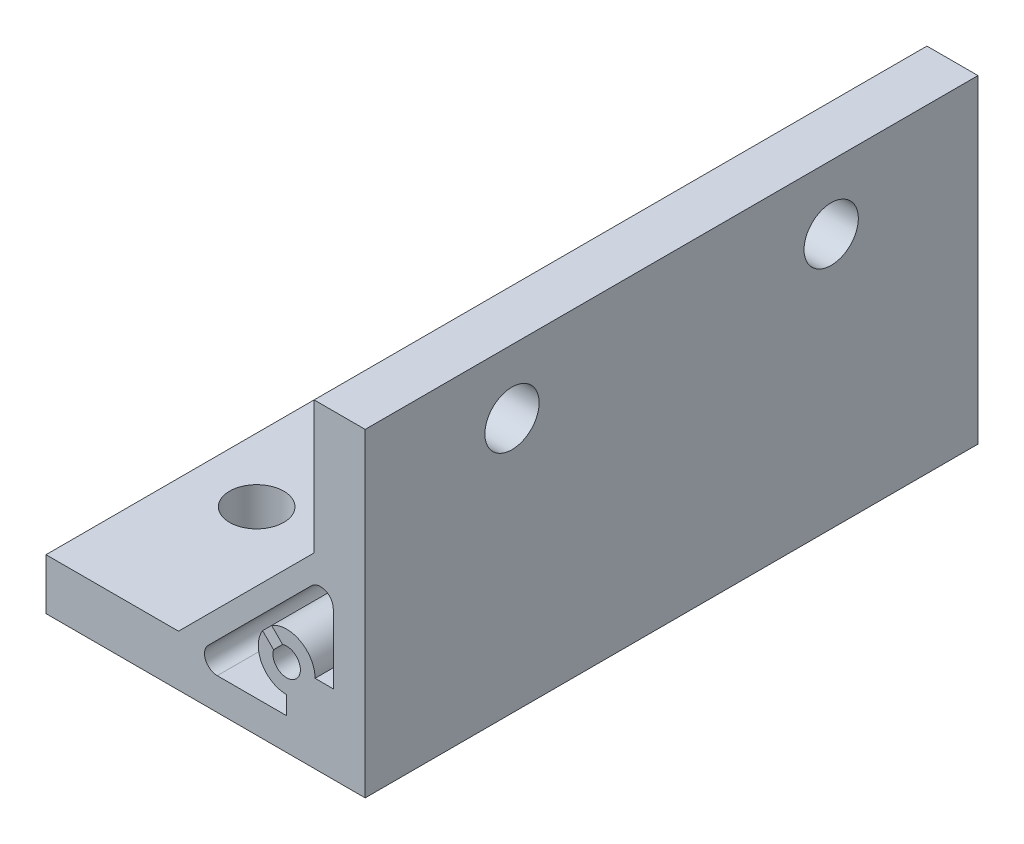
ISO-10303-21;
HEADER;
FILE_DESCRIPTION(('STEP AP214'),'2;1');
FILE_NAME('part.step','',(''),(''),'','','');
FILE_SCHEMA(('AUTOMOTIVE_DESIGN { 1 0 10303 214 1 1 1 1 }'));
ENDSEC;
DATA;
#1=APPLICATION_CONTEXT('core data for automotive mechanical design processes');
#2=APPLICATION_PROTOCOL_DEFINITION('international standard','automotive_design',2000,#1);
#3=PRODUCT_CONTEXT('',#1,'mechanical');
#4=PRODUCT('Part','Part','',(#3));
#5=PRODUCT_RELATED_PRODUCT_CATEGORY('part','',(#4));
#6=PRODUCT_DEFINITION_FORMATION('','',#4);
#7=PRODUCT_DEFINITION_CONTEXT('part definition',#1,'design');
#8=PRODUCT_DEFINITION('design','',#6,#7);
#9=PRODUCT_DEFINITION_SHAPE('','',#8);
#10=(LENGTH_UNIT() NAMED_UNIT(*) SI_UNIT(.MILLI.,.METRE.));
#11=(NAMED_UNIT(*) PLANE_ANGLE_UNIT() SI_UNIT($,.RADIAN.));
#12=(NAMED_UNIT(*) SI_UNIT($,.STERADIAN.) SOLID_ANGLE_UNIT());
#13=UNCERTAINTY_MEASURE_WITH_UNIT(LENGTH_MEASURE(1.E-05),#10,'distance_accuracy_value','');
#14=(GEOMETRIC_REPRESENTATION_CONTEXT(3) GLOBAL_UNCERTAINTY_ASSIGNED_CONTEXT((#13)) GLOBAL_UNIT_ASSIGNED_CONTEXT((#10,
#11,#12)) REPRESENTATION_CONTEXT('',''));
#15=CARTESIAN_POINT('',(0.,0.,0.));
#16=DIRECTION('',(0.,0.,1.));
#17=DIRECTION('',(1.,0.,0.));
#18=AXIS2_PLACEMENT_3D('',#15,#16,#17);
#19=CARTESIAN_POINT('',(50.,0.,48.));
#20=DIRECTION('',(-1.,0.,0.));
#21=DIRECTION('',(0.,0.,1.));
#22=AXIS2_PLACEMENT_3D('',#19,#20,#21);
#23=PLANE('',#22);
#24=CARTESIAN_POINT('',(50.0000000000001,40.,-25.));
#25=DIRECTION('',(1.,0.,0.));
#26=DIRECTION('',(0.,0.,1.));
#27=AXIS2_PLACEMENT_3D('',#24,#25,#26);
#28=CIRCLE('',#27,4.25);
#29=CARTESIAN_POINT('',(50.0000000000001,40.,-20.75));
#30=VERTEX_POINT('',#29);
#31=EDGE_CURVE('E380',#30,#30,#28,.T.);
#32=ORIENTED_EDGE('',*,*,#31,.F.);
#33=EDGE_LOOP('',(#32));
#34=FACE_BOUND('',#33,.T.);
#35=DIRECTION('',(0.,1.,0.));
#36=VECTOR('',#35,1.);
#37=CARTESIAN_POINT('',(50.,0.,-48.));
#38=LINE('',#37,#36);
#39=CARTESIAN_POINT('',(50.,0.,-48.));
#40=VERTEX_POINT('',#39);
#41=CARTESIAN_POINT('',(50.,50.,-48.));
#42=VERTEX_POINT('',#41);
#43=EDGE_CURVE('E283',#40,#42,#38,.T.);
#44=ORIENTED_EDGE('',*,*,#43,.T.);
#45=DIRECTION('',(0.,0.,-1.));
#46=VECTOR('',#45,1.);
#47=CARTESIAN_POINT('',(50.,50.,48.));
#48=LINE('',#47,#46);
#49=CARTESIAN_POINT('',(50.,50.,48.));
#50=VERTEX_POINT('',#49);
#51=EDGE_CURVE('E303',#50,#42,#48,.T.);
#52=ORIENTED_EDGE('',*,*,#51,.F.);
#53=DIRECTION('',(0.,1.,0.));
#54=VECTOR('',#53,1.);
#55=CARTESIAN_POINT('',(50.,0.,48.));
#56=LINE('',#55,#54);
#57=CARTESIAN_POINT('',(50.,0.,48.));
#58=VERTEX_POINT('',#57);
#59=EDGE_CURVE('E268',#58,#50,#56,.T.);
#60=ORIENTED_EDGE('',*,*,#59,.F.);
#61=DIRECTION('',(0.,0.,-1.));
#62=VECTOR('',#61,1.);
#63=CARTESIAN_POINT('',(50.,0.,48.));
#64=LINE('',#63,#62);
#65=EDGE_CURVE('E43',#58,#40,#64,.T.);
#66=ORIENTED_EDGE('',*,*,#65,.T.);
#67=EDGE_LOOP('',(#44,#52,#60,#66));
#68=FACE_BOUND('',#67,.T.);
#69=CARTESIAN_POINT('',(50.0000000000001,40.,25.));
#70=DIRECTION('',(1.,0.,0.));
#71=DIRECTION('',(0.,0.,-1.));
#72=AXIS2_PLACEMENT_3D('',#69,#70,#71);
#73=CIRCLE('',#72,4.25);
#74=CARTESIAN_POINT('',(50.0000000000001,40.,20.75));
#75=VERTEX_POINT('',#74);
#76=EDGE_CURVE('E385',#75,#75,#73,.T.);
#77=ORIENTED_EDGE('',*,*,#76,.F.);
#78=EDGE_LOOP('',(#77));
#79=FACE_BOUND('',#78,.T.);
#80=ADVANCED_FACE('F35',(#34,#68,#79),#23,.F.);
#81=CARTESIAN_POINT('',(42.,29.2426406871192,48.));
#82=DIRECTION('',(1.,0.,0.));
#83=DIRECTION('',(0.,0.,-1.));
#84=AXIS2_PLACEMENT_3D('',#81,#82,#83);
#85=PLANE('',#84);
#86=CARTESIAN_POINT('',(42.0000000000001,40.,-25.));
#87=DIRECTION('',(1.,0.,0.));
#88=DIRECTION('',(0.,0.,1.));
#89=AXIS2_PLACEMENT_3D('',#86,#87,#88);
#90=CIRCLE('',#89,4.25);
#91=CARTESIAN_POINT('',(42.0000000000001,40.,-20.75));
#92=VERTEX_POINT('',#91);
#93=EDGE_CURVE('E382',#92,#92,#90,.T.);
#94=ORIENTED_EDGE('',*,*,#93,.T.);
#95=EDGE_LOOP('',(#94));
#96=FACE_BOUND('',#95,.T.);
#97=DIRECTION('',(0.,-1.,0.));
#98=VECTOR('',#97,1.);
#99=CARTESIAN_POINT('',(42.,29.2426406871192,-48.));
#100=LINE('',#99,#98);
#101=CARTESIAN_POINT('',(42.,50.,-48.));
#102=VERTEX_POINT('',#101);
#103=CARTESIAN_POINT('',(42.,29.2426406871192,-48.));
#104=VERTEX_POINT('',#103);
#105=EDGE_CURVE('E287',#102,#104,#100,.T.);
#106=ORIENTED_EDGE('',*,*,#105,.T.);
#107=DIRECTION('',(0.,0.,-1.));
#108=VECTOR('',#107,1.);
#109=CARTESIAN_POINT('',(42.,29.2426406871192,48.));
#110=LINE('',#109,#108);
#111=CARTESIAN_POINT('',(42.,29.2426406871192,48.));
#112=VERTEX_POINT('',#111);
#113=EDGE_CURVE('E297',#112,#104,#110,.T.);
#114=ORIENTED_EDGE('',*,*,#113,.F.);
#115=DIRECTION('',(0.,-1.,0.));
#116=VECTOR('',#115,1.);
#117=CARTESIAN_POINT('',(42.,29.2426406871192,48.));
#118=LINE('',#117,#116);
#119=CARTESIAN_POINT('',(42.,50.,48.));
#120=VERTEX_POINT('',#119);
#121=EDGE_CURVE('E272',#120,#112,#118,.T.);
#122=ORIENTED_EDGE('',*,*,#121,.F.);
#123=DIRECTION('',(0.,0.,-1.));
#124=VECTOR('',#123,1.);
#125=CARTESIAN_POINT('',(42.,50.,48.));
#126=LINE('',#125,#124);
#127=EDGE_CURVE('E300',#120,#102,#126,.T.);
#128=ORIENTED_EDGE('',*,*,#127,.T.);
#129=EDGE_LOOP('',(#106,#114,#122,#128));
#130=FACE_BOUND('',#129,.T.);
#131=CARTESIAN_POINT('',(42.0000000000001,40.,25.));
#132=DIRECTION('',(1.,0.,0.));
#133=DIRECTION('',(0.,0.,-1.));
#134=AXIS2_PLACEMENT_3D('',#131,#132,#133);
#135=CIRCLE('',#134,4.25);
#136=CARTESIAN_POINT('',(42.0000000000001,40.,20.75));
#137=VERTEX_POINT('',#136);
#138=EDGE_CURVE('E388',#137,#137,#135,.T.);
#139=ORIENTED_EDGE('',*,*,#138,.T.);
#140=EDGE_LOOP('',(#139));
#141=FACE_BOUND('',#140,.T.);
#142=ADVANCED_FACE('F326',(#96,#130,#141),#85,.F.);
#143=CARTESIAN_POINT('',(0.,0.,48.));
#144=DIRECTION('',(0.,0.,1.));
#145=DIRECTION('',(1.,0.,0.));
#146=AXIS2_PLACEMENT_3D('',#143,#144,#145);
#147=PLANE('',#146);
#148=DIRECTION('',(0.,-1.,0.));
#149=VECTOR('',#148,1.);
#150=CARTESIAN_POINT('',(0.,8.,48.));
#151=LINE('',#150,#149);
#152=CARTESIAN_POINT('',(0.,8.,48.));
#153=VERTEX_POINT('',#152);
#154=CARTESIAN_POINT('',(0.,0.,48.));
#155=VERTEX_POINT('',#154);
#156=EDGE_CURVE('E262',#153,#155,#151,.T.);
#157=ORIENTED_EDGE('',*,*,#156,.T.);
#158=DIRECTION('',(1.,0.,0.));
#159=VECTOR('',#158,1.);
#160=CARTESIAN_POINT('',(0.,0.,48.));
#161=LINE('',#160,#159);
#162=EDGE_CURVE('E265',#155,#58,#161,.T.);
#163=ORIENTED_EDGE('',*,*,#162,.T.);
#164=ORIENTED_EDGE('',*,*,#59,.T.);
#165=DIRECTION('',(-1.,0.,0.));
#166=VECTOR('',#165,1.);
#167=CARTESIAN_POINT('',(42.,50.,48.));
#168=LINE('',#167,#166);
#169=EDGE_CURVE('E270',#50,#120,#168,.T.);
#170=ORIENTED_EDGE('',*,*,#169,.T.);
#171=ORIENTED_EDGE('',*,*,#121,.T.);
#172=DIRECTION('',(-0.707106781186546,-0.707106781186549,0.));
#173=VECTOR('',#172,1.);
#174=CARTESIAN_POINT('',(20.7573593128809,8.,48.));
#175=LINE('',#174,#173);
#176=CARTESIAN_POINT('',(20.7573593128809,8.,48.));
#177=VERTEX_POINT('',#176);
#178=EDGE_CURVE('E274',#112,#177,#175,.T.);
#179=ORIENTED_EDGE('',*,*,#178,.T.);
#180=DIRECTION('',(-1.,0.,0.));
#181=VECTOR('',#180,1.);
#182=CARTESIAN_POINT('',(0.,8.,48.));
#183=LINE('',#182,#181);
#184=EDGE_CURVE('E276',#177,#153,#183,.T.);
#185=ORIENTED_EDGE('',*,*,#184,.T.);
#186=EDGE_LOOP('',(#157,#163,#164,#170,#171,#179,#185));
#187=FACE_BOUND('',#186,.T.);
#188=DIRECTION('',(0.707106781186549,-0.707106781186546,0.));
#189=VECTOR('',#188,1.);
#190=CARTESIAN_POINT('',(35.647066335444,12.9387201021829,48.));
#191=LINE('',#190,#189);
#192=CARTESIAN_POINT('',(33.9267474297161,14.6590390079109,48.));
#193=VERTEX_POINT('',#192);
#194=CARTESIAN_POINT('',(35.647066335444,12.9387201021829,48.));
#195=VERTEX_POINT('',#194);
#196=EDGE_CURVE('E174',#193,#195,#191,.T.);
#197=ORIENTED_EDGE('',*,*,#196,.F.);
#198=CARTESIAN_POINT('',(37.7,12.3,48.));
#199=DIRECTION('',(0.,0.,-1.));
#200=DIRECTION('',(1.,0.,0.));
#201=AXIS2_PLACEMENT_3D('',#198,#199,#200);
#202=CIRCLE('',#201,4.45);
#203=CARTESIAN_POINT('',(37.7,7.84999999999995,48.));
#204=VERTEX_POINT('',#203);
#205=EDGE_CURVE('E166',#204,#193,#202,.T.);
#206=ORIENTED_EDGE('',*,*,#205,.F.);
#207=DIRECTION('',(0.,1.,0.));
#208=VECTOR('',#207,1.);
#209=CARTESIAN_POINT('',(37.7,5.,48.));
#210=LINE('',#209,#208);
#211=CARTESIAN_POINT('',(37.7,5.,48.));
#212=VERTEX_POINT('',#211);
#213=EDGE_CURVE('E209',#212,#204,#210,.T.);
#214=ORIENTED_EDGE('',*,*,#213,.F.);
#215=DIRECTION('',(1.,0.,0.));
#216=VECTOR('',#215,1.);
#217=CARTESIAN_POINT('',(26.828427124746,5.,48.));
#218=LINE('',#217,#216);
#219=CARTESIAN_POINT('',(26.828427124746,4.99999999999993,48.));
#220=VERTEX_POINT('',#219);
#221=EDGE_CURVE('E207',#220,#212,#218,.T.);
#222=ORIENTED_EDGE('',*,*,#221,.F.);
#223=CARTESIAN_POINT('',(26.8284271247464,7.00000000000011,48.));
#224=DIRECTION('',(0.,0.,1.));
#225=DIRECTION('',(1.,0.,0.));
#226=AXIS2_PLACEMENT_3D('',#223,#224,#225);
#227=CIRCLE('',#226,2.00000000000019);
#228=CARTESIAN_POINT('',(25.4142135623729,8.41421356237311,48.));
#229=VERTEX_POINT('',#228);
#230=EDGE_CURVE('E205',#229,#220,#227,.T.);
#231=ORIENTED_EDGE('',*,*,#230,.F.);
#232=DIRECTION('',(-0.70710678118655,-0.707106781186545,0.));
#233=VECTOR('',#232,1.);
#234=CARTESIAN_POINT('',(25.4142135623729,8.41421356237311,48.));
#235=LINE('',#234,#233);
#236=CARTESIAN_POINT('',(41.585786437627,24.5857864376269,48.));
#237=VERTEX_POINT('',#236);
#238=EDGE_CURVE('E203',#237,#229,#235,.T.);
#239=ORIENTED_EDGE('',*,*,#238,.F.);
#240=CARTESIAN_POINT('',(43.0000000000002,23.171572875254,48.));
#241=DIRECTION('',(0.,0.,1.));
#242=DIRECTION('',(1.,0.,0.));
#243=AXIS2_PLACEMENT_3D('',#240,#241,#242);
#244=CIRCLE('',#243,1.99999999999993);
#245=CARTESIAN_POINT('',(45.,23.1715728752539,48.));
#246=VERTEX_POINT('',#245);
#247=EDGE_CURVE('E201',#246,#237,#244,.T.);
#248=ORIENTED_EDGE('',*,*,#247,.F.);
#249=DIRECTION('',(0.,1.,0.));
#250=VECTOR('',#249,1.);
#251=CARTESIAN_POINT('',(45.,23.1715728752539,48.));
#252=LINE('',#251,#250);
#253=CARTESIAN_POINT('',(45.,12.3,48.));
#254=VERTEX_POINT('',#253);
#255=EDGE_CURVE('E199',#254,#246,#252,.T.);
#256=ORIENTED_EDGE('',*,*,#255,.F.);
#257=DIRECTION('',(1.,0.,0.));
#258=VECTOR('',#257,1.);
#259=CARTESIAN_POINT('',(42.15,12.3,48.));
#260=LINE('',#259,#258);
#261=CARTESIAN_POINT('',(42.15,12.3,48.));
#262=VERTEX_POINT('',#261);
#263=EDGE_CURVE('E197',#262,#254,#260,.T.);
#264=ORIENTED_EDGE('',*,*,#263,.F.);
#265=CARTESIAN_POINT('',(37.7,12.3,48.));
#266=DIRECTION('',(0.,0.,-1.));
#267=DIRECTION('',(1.,0.,0.));
#268=AXIS2_PLACEMENT_3D('',#265,#266,#267);
#269=CIRCLE('',#268,4.45);
#270=CARTESIAN_POINT('',(35.3409609920885,16.0732525702836,48.));
#271=VERTEX_POINT('',#270);
#272=EDGE_CURVE('E195',#271,#262,#269,.T.);
#273=ORIENTED_EDGE('',*,*,#272,.F.);
#274=DIRECTION('',(-0.707106781186684,0.707106781186411,0.));
#275=VECTOR('',#274,1.);
#276=CARTESIAN_POINT('',(37.0612798978168,14.3529336645559,48.));
#277=LINE('',#276,#275);
#278=CARTESIAN_POINT('',(37.0612798978168,14.3529336645559,48.));
#279=VERTEX_POINT('',#278);
#280=EDGE_CURVE('E190',#279,#271,#277,.T.);
#281=ORIENTED_EDGE('',*,*,#280,.F.);
#282=CARTESIAN_POINT('',(37.7,12.3,48.));
#283=DIRECTION('',(0.,0.,1.));
#284=DIRECTION('',(1.,0.,0.));
#285=AXIS2_PLACEMENT_3D('',#282,#283,#284);
#286=CIRCLE('',#285,2.15);
#287=EDGE_CURVE('E188',#195,#279,#286,.T.);
#288=ORIENTED_EDGE('',*,*,#287,.F.);
#289=EDGE_LOOP('',(#197,#206,#214,#222,#231,#239,#248,#256,#264,#273,#281,#288));
#290=FACE_BOUND('',#289,.T.);
#291=ADVANCED_FACE('F186',(#187,#290),#147,.T.);
#292=CARTESIAN_POINT('',(0.,0.,-48.));
#293=DIRECTION('',(0.,0.,1.));
#294=DIRECTION('',(1.,0.,0.));
#295=AXIS2_PLACEMENT_3D('',#292,#293,#294);
#296=PLANE('',#295);
#297=DIRECTION('',(0.,-1.,0.));
#298=VECTOR('',#297,1.);
#299=CARTESIAN_POINT('',(0.,8.,-48.));
#300=LINE('',#299,#298);
#301=CARTESIAN_POINT('',(0.,8.,-48.));
#302=VERTEX_POINT('',#301);
#303=CARTESIAN_POINT('',(0.,0.,-48.));
#304=VERTEX_POINT('',#303);
#305=EDGE_CURVE('E182',#302,#304,#300,.T.);
#306=ORIENTED_EDGE('',*,*,#305,.F.);
#307=DIRECTION('',(-1.,0.,0.));
#308=VECTOR('',#307,1.);
#309=CARTESIAN_POINT('',(0.,8.,-48.));
#310=LINE('',#309,#308);
#311=CARTESIAN_POINT('',(20.7573593128809,8.,-48.));
#312=VERTEX_POINT('',#311);
#313=EDGE_CURVE('E266',#312,#302,#310,.T.);
#314=ORIENTED_EDGE('',*,*,#313,.F.);
#315=DIRECTION('',(-0.707106781186546,-0.707106781186549,0.));
#316=VECTOR('',#315,1.);
#317=CARTESIAN_POINT('',(20.7573593128809,8.,-48.));
#318=LINE('',#317,#316);
#319=EDGE_CURVE('E289',#104,#312,#318,.T.);
#320=ORIENTED_EDGE('',*,*,#319,.F.);
#321=ORIENTED_EDGE('',*,*,#105,.F.);
#322=DIRECTION('',(-1.,0.,0.));
#323=VECTOR('',#322,1.);
#324=CARTESIAN_POINT('',(42.,50.,-48.));
#325=LINE('',#324,#323);
#326=EDGE_CURVE('E285',#42,#102,#325,.T.);
#327=ORIENTED_EDGE('',*,*,#326,.F.);
#328=ORIENTED_EDGE('',*,*,#43,.F.);
#329=DIRECTION('',(1.,0.,0.));
#330=VECTOR('',#329,1.);
#331=CARTESIAN_POINT('',(0.,0.,-48.));
#332=LINE('',#331,#330);
#333=EDGE_CURVE('E281',#304,#40,#332,.T.);
#334=ORIENTED_EDGE('',*,*,#333,.F.);
#335=EDGE_LOOP('',(#306,#314,#320,#321,#327,#328,#334));
#336=FACE_BOUND('',#335,.T.);
#337=CARTESIAN_POINT('',(37.7,12.3,-48.));
#338=DIRECTION('',(0.,0.,-1.));
#339=DIRECTION('',(1.,0.,0.));
#340=AXIS2_PLACEMENT_3D('',#337,#338,#339);
#341=CIRCLE('',#340,4.45);
#342=CARTESIAN_POINT('',(37.7,7.84999999999995,-48.));
#343=VERTEX_POINT('',#342);
#344=CARTESIAN_POINT('',(33.9267474297161,14.6590390079109,-48.));
#345=VERTEX_POINT('',#344);
#346=EDGE_CURVE('E58',#343,#345,#341,.T.);
#347=ORIENTED_EDGE('',*,*,#346,.T.);
#348=DIRECTION('',(0.707106781186549,-0.707106781186546,0.));
#349=VECTOR('',#348,1.);
#350=CARTESIAN_POINT('',(35.647066335444,12.9387201021829,-48.));
#351=LINE('',#350,#349);
#352=CARTESIAN_POINT('',(35.647066335444,12.9387201021829,-48.));
#353=VERTEX_POINT('',#352);
#354=EDGE_CURVE('E181',#345,#353,#351,.T.);
#355=ORIENTED_EDGE('',*,*,#354,.T.);
#356=CARTESIAN_POINT('',(37.7,12.3,-48.));
#357=DIRECTION('',(0.,0.,1.));
#358=DIRECTION('',(1.,0.,0.));
#359=AXIS2_PLACEMENT_3D('',#356,#357,#358);
#360=CIRCLE('',#359,2.15);
#361=CARTESIAN_POINT('',(37.0612798978168,14.3529336645559,-48.));
#362=VERTEX_POINT('',#361);
#363=EDGE_CURVE('E214',#353,#362,#360,.T.);
#364=ORIENTED_EDGE('',*,*,#363,.T.);
#365=DIRECTION('',(-0.707106781186684,0.707106781186411,0.));
#366=VECTOR('',#365,1.);
#367=CARTESIAN_POINT('',(37.0612798978168,14.3529336645559,-48.));
#368=LINE('',#367,#366);
#369=CARTESIAN_POINT('',(35.3409609920885,16.0732525702836,-48.));
#370=VERTEX_POINT('',#369);
#371=EDGE_CURVE('E217',#362,#370,#368,.T.);
#372=ORIENTED_EDGE('',*,*,#371,.T.);
#373=CARTESIAN_POINT('',(37.7,12.3,-48.));
#374=DIRECTION('',(0.,0.,-1.));
#375=DIRECTION('',(1.,0.,0.));
#376=AXIS2_PLACEMENT_3D('',#373,#374,#375);
#377=CIRCLE('',#376,4.45);
#378=CARTESIAN_POINT('',(42.15,12.3,-48.));
#379=VERTEX_POINT('',#378);
#380=EDGE_CURVE('E220',#370,#379,#377,.T.);
#381=ORIENTED_EDGE('',*,*,#380,.T.);
#382=DIRECTION('',(1.,0.,0.));
#383=VECTOR('',#382,1.);
#384=CARTESIAN_POINT('',(42.15,12.3,-48.));
#385=LINE('',#384,#383);
#386=CARTESIAN_POINT('',(45.,12.3,-48.));
#387=VERTEX_POINT('',#386);
#388=EDGE_CURVE('E223',#379,#387,#385,.T.);
#389=ORIENTED_EDGE('',*,*,#388,.T.);
#390=DIRECTION('',(0.,1.,0.));
#391=VECTOR('',#390,1.);
#392=CARTESIAN_POINT('',(45.,23.1715728752539,-48.));
#393=LINE('',#392,#391);
#394=CARTESIAN_POINT('',(45.,23.1715728752539,-48.));
#395=VERTEX_POINT('',#394);
#396=EDGE_CURVE('E226',#387,#395,#393,.T.);
#397=ORIENTED_EDGE('',*,*,#396,.T.);
#398=CARTESIAN_POINT('',(43.0000000000002,23.171572875254,-48.));
#399=DIRECTION('',(0.,0.,1.));
#400=DIRECTION('',(1.,0.,0.));
#401=AXIS2_PLACEMENT_3D('',#398,#399,#400);
#402=CIRCLE('',#401,1.99999999999993);
#403=CARTESIAN_POINT('',(41.585786437627,24.5857864376269,-48.));
#404=VERTEX_POINT('',#403);
#405=EDGE_CURVE('E229',#395,#404,#402,.T.);
#406=ORIENTED_EDGE('',*,*,#405,.T.);
#407=DIRECTION('',(-0.70710678118655,-0.707106781186545,0.));
#408=VECTOR('',#407,1.);
#409=CARTESIAN_POINT('',(25.4142135623729,8.41421356237311,-48.));
#410=LINE('',#409,#408);
#411=CARTESIAN_POINT('',(25.4142135623729,8.41421356237311,-48.));
#412=VERTEX_POINT('',#411);
#413=EDGE_CURVE('E232',#404,#412,#410,.T.);
#414=ORIENTED_EDGE('',*,*,#413,.T.);
#415=CARTESIAN_POINT('',(26.8284271247464,7.00000000000011,-48.));
#416=DIRECTION('',(0.,0.,1.));
#417=DIRECTION('',(1.,0.,0.));
#418=AXIS2_PLACEMENT_3D('',#415,#416,#417);
#419=CIRCLE('',#418,2.00000000000019);
#420=CARTESIAN_POINT('',(26.828427124746,4.99999999999993,-48.));
#421=VERTEX_POINT('',#420);
#422=EDGE_CURVE('E235',#412,#421,#419,.T.);
#423=ORIENTED_EDGE('',*,*,#422,.T.);
#424=DIRECTION('',(1.,0.,0.));
#425=VECTOR('',#424,1.);
#426=CARTESIAN_POINT('',(26.828427124746,5.,-48.));
#427=LINE('',#426,#425);
#428=CARTESIAN_POINT('',(37.7,5.,-48.));
#429=VERTEX_POINT('',#428);
#430=EDGE_CURVE('E238',#421,#429,#427,.T.);
#431=ORIENTED_EDGE('',*,*,#430,.T.);
#432=DIRECTION('',(0.,1.,0.));
#433=VECTOR('',#432,1.);
#434=CARTESIAN_POINT('',(37.7,5.,-48.));
#435=LINE('',#434,#433);
#436=EDGE_CURVE('E175',#429,#343,#435,.T.);
#437=ORIENTED_EDGE('',*,*,#436,.T.);
#438=EDGE_LOOP('',(#347,#355,#364,#372,#381,#389,#397,#406,#414,#423,#431,#437));
#439=FACE_BOUND('',#438,.T.);
#440=ADVANCED_FACE('F316',(#336,#439),#296,.F.);
#441=CARTESIAN_POINT('',(0.,8.,48.));
#442=DIRECTION('',(1.,0.,0.));
#443=DIRECTION('',(0.,0.,-1.));
#444=AXIS2_PLACEMENT_3D('',#441,#442,#443);
#445=PLANE('',#444);
#446=ORIENTED_EDGE('',*,*,#305,.T.);
#447=DIRECTION('',(0.,0.,-1.));
#448=VECTOR('',#447,1.);
#449=CARTESIAN_POINT('',(0.,0.,48.));
#450=LINE('',#449,#448);
#451=EDGE_CURVE('E11',#155,#304,#450,.T.);
#452=ORIENTED_EDGE('',*,*,#451,.F.);
#453=ORIENTED_EDGE('',*,*,#156,.F.);
#454=DIRECTION('',(0.,0.,-1.));
#455=VECTOR('',#454,1.);
#456=CARTESIAN_POINT('',(0.,8.,48.));
#457=LINE('',#456,#455);
#458=EDGE_CURVE('E278',#153,#302,#457,.T.);
#459=ORIENTED_EDGE('',*,*,#458,.T.);
#460=EDGE_LOOP('',(#446,#452,#453,#459));
#461=FACE_BOUND('',#460,.T.);
#462=ADVANCED_FACE('F37',(#461),#445,.F.);
#463=CARTESIAN_POINT('',(0.,0.,48.));
#464=DIRECTION('',(0.,1.,0.));
#465=DIRECTION('',(0.,0.,1.));
#466=AXIS2_PLACEMENT_3D('',#463,#464,#465);
#467=PLANE('',#466);
#468=CARTESIAN_POINT('',(10.,0.,25.));
#469=DIRECTION('',(0.,1.,0.));
#470=DIRECTION('',(0.,0.,-1.));
#471=AXIS2_PLACEMENT_3D('',#468,#469,#470);
#472=CIRCLE('',#471,4.25);
#473=CARTESIAN_POINT('',(10.,0.,20.75));
#474=VERTEX_POINT('',#473);
#475=EDGE_CURVE('E369',#474,#474,#472,.T.);
#476=ORIENTED_EDGE('',*,*,#475,.T.);
#477=EDGE_LOOP('',(#476));
#478=FACE_BOUND('',#477,.T.);
#479=CARTESIAN_POINT('',(10.,0.,-25.));
#480=DIRECTION('',(0.,1.,0.));
#481=DIRECTION('',(0.,0.,1.));
#482=AXIS2_PLACEMENT_3D('',#479,#480,#481);
#483=CIRCLE('',#482,4.25);
#484=CARTESIAN_POINT('',(10.,0.,-20.75));
#485=VERTEX_POINT('',#484);
#486=EDGE_CURVE('E212',#485,#485,#483,.T.);
#487=ORIENTED_EDGE('',*,*,#486,.T.);
#488=EDGE_LOOP('',(#487));
#489=FACE_BOUND('',#488,.T.);
#490=ORIENTED_EDGE('',*,*,#333,.T.);
#491=ORIENTED_EDGE('',*,*,#65,.F.);
#492=ORIENTED_EDGE('',*,*,#162,.F.);
#493=ORIENTED_EDGE('',*,*,#451,.T.);
#494=EDGE_LOOP('',(#490,#491,#492,#493));
#495=FACE_BOUND('',#494,.T.);
#496=ADVANCED_FACE('F334',(#478,#489,#495),#467,.F.);
#497=CARTESIAN_POINT('',(42.,50.,48.));
#498=DIRECTION('',(0.,-1.,0.));
#499=DIRECTION('',(0.,0.,-1.));
#500=AXIS2_PLACEMENT_3D('',#497,#498,#499);
#501=PLANE('',#500);
#502=ORIENTED_EDGE('',*,*,#326,.T.);
#503=ORIENTED_EDGE('',*,*,#127,.F.);
#504=ORIENTED_EDGE('',*,*,#169,.F.);
#505=ORIENTED_EDGE('',*,*,#51,.T.);
#506=EDGE_LOOP('',(#502,#503,#504,#505));
#507=FACE_BOUND('',#506,.T.);
#508=ADVANCED_FACE('F322',(#507),#501,.F.);
#509=CARTESIAN_POINT('',(20.7573593128809,8.,48.));
#510=DIRECTION('',(0.707106781186549,-0.707106781186546,0.));
#511=DIRECTION('',(0.707106781186546,0.707106781186549,0.));
#512=AXIS2_PLACEMENT_3D('',#509,#510,#511);
#513=PLANE('',#512);
#514=ORIENTED_EDGE('',*,*,#319,.T.);
#515=DIRECTION('',(0.,0.,-1.));
#516=VECTOR('',#515,1.);
#517=CARTESIAN_POINT('',(20.7573593128809,8.,48.));
#518=LINE('',#517,#516);
#519=EDGE_CURVE('E294',#177,#312,#518,.T.);
#520=ORIENTED_EDGE('',*,*,#519,.F.);
#521=ORIENTED_EDGE('',*,*,#178,.F.);
#522=ORIENTED_EDGE('',*,*,#113,.T.);
#523=EDGE_LOOP('',(#514,#520,#521,#522));
#524=FACE_BOUND('',#523,.T.);
#525=ADVANCED_FACE('F342',(#524),#513,.F.);
#526=CARTESIAN_POINT('',(0.,8.,48.));
#527=DIRECTION('',(0.,-1.,0.));
#528=DIRECTION('',(0.,0.,-1.));
#529=AXIS2_PLACEMENT_3D('',#526,#527,#528);
#530=PLANE('',#529);
#531=CARTESIAN_POINT('',(10.,8.,25.));
#532=DIRECTION('',(0.,1.,0.));
#533=DIRECTION('',(0.,0.,-1.));
#534=AXIS2_PLACEMENT_3D('',#531,#532,#533);
#535=CIRCLE('',#534,4.25);
#536=CARTESIAN_POINT('',(10.,8.,20.75));
#537=VERTEX_POINT('',#536);
#538=EDGE_CURVE('E377',#537,#537,#535,.T.);
#539=ORIENTED_EDGE('',*,*,#538,.F.);
#540=EDGE_LOOP('',(#539));
#541=FACE_BOUND('',#540,.T.);
#542=CARTESIAN_POINT('',(10.,8.,-25.));
#543=DIRECTION('',(0.,1.,0.));
#544=DIRECTION('',(0.,0.,1.));
#545=AXIS2_PLACEMENT_3D('',#542,#543,#544);
#546=CIRCLE('',#545,4.25);
#547=CARTESIAN_POINT('',(10.,8.,-20.75));
#548=VERTEX_POINT('',#547);
#549=EDGE_CURVE('E373',#548,#548,#546,.T.);
#550=ORIENTED_EDGE('',*,*,#549,.F.);
#551=EDGE_LOOP('',(#550));
#552=FACE_BOUND('',#551,.T.);
#553=ORIENTED_EDGE('',*,*,#313,.T.);
#554=ORIENTED_EDGE('',*,*,#458,.F.);
#555=ORIENTED_EDGE('',*,*,#184,.F.);
#556=ORIENTED_EDGE('',*,*,#519,.T.);
#557=EDGE_LOOP('',(#553,#554,#555,#556));
#558=FACE_BOUND('',#557,.T.);
#559=ADVANCED_FACE('F339',(#541,#552,#558),#530,.F.);
#560=CARTESIAN_POINT('',(37.7,12.3,48.));
#561=DIRECTION('',(0.,0.,-1.));
#562=DIRECTION('',(-1.,0.,0.));
#563=AXIS2_PLACEMENT_3D('',#560,#561,#562);
#564=CYLINDRICAL_SURFACE('',#563,4.45);
#565=ORIENTED_EDGE('',*,*,#346,.F.);
#566=DIRECTION('',(0.,0.,-1.));
#567=VECTOR('',#566,1.);
#568=CARTESIAN_POINT('',(37.7,7.84999999999995,48.));
#569=LINE('',#568,#567);
#570=EDGE_CURVE('E170',#204,#343,#569,.T.);
#571=ORIENTED_EDGE('',*,*,#570,.F.);
#572=ORIENTED_EDGE('',*,*,#205,.T.);
#573=DIRECTION('',(0.,0.,-1.));
#574=VECTOR('',#573,1.);
#575=CARTESIAN_POINT('',(33.9267474297161,14.6590390079109,48.));
#576=LINE('',#575,#574);
#577=EDGE_CURVE('E169',#193,#345,#576,.T.);
#578=ORIENTED_EDGE('',*,*,#577,.T.);
#579=EDGE_LOOP('',(#565,#571,#572,#578));
#580=FACE_BOUND('',#579,.T.);
#581=ADVANCED_FACE('F168',(#580),#564,.T.);
#582=CARTESIAN_POINT('',(35.647066335444,12.9387201021829,48.));
#583=DIRECTION('',(0.707106781186546,0.707106781186549,0.));
#584=DIRECTION('',(-0.707106781186549,0.707106781186546,0.));
#585=AXIS2_PLACEMENT_3D('',#582,#583,#584);
#586=PLANE('',#585);
#587=ORIENTED_EDGE('',*,*,#354,.F.);
#588=ORIENTED_EDGE('',*,*,#577,.F.);
#589=ORIENTED_EDGE('',*,*,#196,.T.);
#590=DIRECTION('',(0.,0.,-1.));
#591=VECTOR('',#590,1.);
#592=CARTESIAN_POINT('',(35.647066335444,12.9387201021829,48.));
#593=LINE('',#592,#591);
#594=EDGE_CURVE('E183',#195,#353,#593,.T.);
#595=ORIENTED_EDGE('',*,*,#594,.T.);
#596=EDGE_LOOP('',(#587,#588,#589,#595));
#597=FACE_BOUND('',#596,.T.);
#598=ADVANCED_FACE('F178',(#597),#586,.T.);
#599=CARTESIAN_POINT('',(37.7,12.3,48.));
#600=DIRECTION('',(0.,0.,-1.));
#601=DIRECTION('',(-1.,0.,0.));
#602=AXIS2_PLACEMENT_3D('',#599,#600,#601);
#603=CYLINDRICAL_SURFACE('',#602,2.15);
#604=ORIENTED_EDGE('',*,*,#363,.F.);
#605=ORIENTED_EDGE('',*,*,#594,.F.);
#606=ORIENTED_EDGE('',*,*,#287,.T.);
#607=DIRECTION('',(0.,0.,-1.));
#608=VECTOR('',#607,1.);
#609=CARTESIAN_POINT('',(37.0612798978168,14.3529336645559,48.));
#610=LINE('',#609,#608);
#611=EDGE_CURVE('E259',#279,#362,#610,.T.);
#612=ORIENTED_EDGE('',*,*,#611,.T.);
#613=EDGE_LOOP('',(#604,#605,#606,#612));
#614=FACE_BOUND('',#613,.T.);
#615=ADVANCED_FACE('F447',(#614),#603,.F.);
#616=CARTESIAN_POINT('',(37.0612798978168,14.3529336645559,48.));
#617=DIRECTION('',(-0.707106781186411,-0.707106781186684,0.));
#618=DIRECTION('',(0.707106781186684,-0.707106781186411,0.));
#619=AXIS2_PLACEMENT_3D('',#616,#617,#618);
#620=PLANE('',#619);
#621=ORIENTED_EDGE('',*,*,#371,.F.);
#622=ORIENTED_EDGE('',*,*,#611,.F.);
#623=ORIENTED_EDGE('',*,*,#280,.T.);
#624=DIRECTION('',(0.,0.,-1.));
#625=VECTOR('',#624,1.);
#626=CARTESIAN_POINT('',(35.3409609920885,16.0732525702836,48.));
#627=LINE('',#626,#625);
#628=EDGE_CURVE('E257',#271,#370,#627,.T.);
#629=ORIENTED_EDGE('',*,*,#628,.T.);
#630=EDGE_LOOP('',(#621,#622,#623,#629));
#631=FACE_BOUND('',#630,.T.);
#632=ADVANCED_FACE('F443',(#631),#620,.T.);
#633=CARTESIAN_POINT('',(37.7,12.3,48.));
#634=DIRECTION('',(0.,0.,-1.));
#635=DIRECTION('',(-1.,0.,0.));
#636=AXIS2_PLACEMENT_3D('',#633,#634,#635);
#637=CYLINDRICAL_SURFACE('',#636,4.45);
#638=ORIENTED_EDGE('',*,*,#380,.F.);
#639=ORIENTED_EDGE('',*,*,#628,.F.);
#640=ORIENTED_EDGE('',*,*,#272,.T.);
#641=DIRECTION('',(0.,0.,-1.));
#642=VECTOR('',#641,1.);
#643=CARTESIAN_POINT('',(42.15,12.3,48.));
#644=LINE('',#643,#642);
#645=EDGE_CURVE('E255',#262,#379,#644,.T.);
#646=ORIENTED_EDGE('',*,*,#645,.T.);
#647=EDGE_LOOP('',(#638,#639,#640,#646));
#648=FACE_BOUND('',#647,.T.);
#649=ADVANCED_FACE('F439',(#648),#637,.T.);
#650=CARTESIAN_POINT('',(42.15,12.3,48.));
#651=DIRECTION('',(0.,1.,0.));
#652=DIRECTION('',(0.,0.,1.));
#653=AXIS2_PLACEMENT_3D('',#650,#651,#652);
#654=PLANE('',#653);
#655=ORIENTED_EDGE('',*,*,#388,.F.);
#656=ORIENTED_EDGE('',*,*,#645,.F.);
#657=ORIENTED_EDGE('',*,*,#263,.T.);
#658=DIRECTION('',(0.,0.,-1.));
#659=VECTOR('',#658,1.);
#660=CARTESIAN_POINT('',(45.,12.3,48.));
#661=LINE('',#660,#659);
#662=EDGE_CURVE('E253',#254,#387,#661,.T.);
#663=ORIENTED_EDGE('',*,*,#662,.T.);
#664=EDGE_LOOP('',(#655,#656,#657,#663));
#665=FACE_BOUND('',#664,.T.);
#666=ADVANCED_FACE('F435',(#665),#654,.T.);
#667=CARTESIAN_POINT('',(45.,23.1715728752539,48.));
#668=DIRECTION('',(-1.,0.,0.));
#669=DIRECTION('',(0.,0.,1.));
#670=AXIS2_PLACEMENT_3D('',#667,#668,#669);
#671=PLANE('',#670);
#672=ORIENTED_EDGE('',*,*,#396,.F.);
#673=ORIENTED_EDGE('',*,*,#662,.F.);
#674=ORIENTED_EDGE('',*,*,#255,.T.);
#675=DIRECTION('',(0.,0.,-1.));
#676=VECTOR('',#675,1.);
#677=CARTESIAN_POINT('',(45.,23.1715728752539,48.));
#678=LINE('',#677,#676);
#679=EDGE_CURVE('E251',#246,#395,#678,.T.);
#680=ORIENTED_EDGE('',*,*,#679,.T.);
#681=EDGE_LOOP('',(#672,#673,#674,#680));
#682=FACE_BOUND('',#681,.T.);
#683=ADVANCED_FACE('F431',(#682),#671,.T.);
#684=CARTESIAN_POINT('',(43.0000000000002,23.171572875254,48.));
#685=DIRECTION('',(0.,0.,-1.));
#686=DIRECTION('',(-1.,0.,0.));
#687=AXIS2_PLACEMENT_3D('',#684,#685,#686);
#688=CYLINDRICAL_SURFACE('',#687,1.99999999999993);
#689=ORIENTED_EDGE('',*,*,#405,.F.);
#690=ORIENTED_EDGE('',*,*,#679,.F.);
#691=ORIENTED_EDGE('',*,*,#247,.T.);
#692=DIRECTION('',(0.,0.,-1.));
#693=VECTOR('',#692,1.);
#694=CARTESIAN_POINT('',(41.585786437627,24.5857864376269,48.));
#695=LINE('',#694,#693);
#696=EDGE_CURVE('E249',#237,#404,#695,.T.);
#697=ORIENTED_EDGE('',*,*,#696,.T.);
#698=EDGE_LOOP('',(#689,#690,#691,#697));
#699=FACE_BOUND('',#698,.T.);
#700=ADVANCED_FACE('F427',(#699),#688,.F.);
#701=CARTESIAN_POINT('',(25.4142135623729,8.41421356237311,48.));
#702=DIRECTION('',(0.707106781186545,-0.70710678118655,0.));
#703=DIRECTION('',(0.70710678118655,0.707106781186545,0.));
#704=AXIS2_PLACEMENT_3D('',#701,#702,#703);
#705=PLANE('',#704);
#706=ORIENTED_EDGE('',*,*,#413,.F.);
#707=ORIENTED_EDGE('',*,*,#696,.F.);
#708=ORIENTED_EDGE('',*,*,#238,.T.);
#709=DIRECTION('',(0.,0.,-1.));
#710=VECTOR('',#709,1.);
#711=CARTESIAN_POINT('',(25.4142135623729,8.41421356237311,48.));
#712=LINE('',#711,#710);
#713=EDGE_CURVE('E247',#229,#412,#712,.T.);
#714=ORIENTED_EDGE('',*,*,#713,.T.);
#715=EDGE_LOOP('',(#706,#707,#708,#714));
#716=FACE_BOUND('',#715,.T.);
#717=ADVANCED_FACE('F423',(#716),#705,.T.);
#718=CARTESIAN_POINT('',(26.8284271247464,7.00000000000011,48.));
#719=DIRECTION('',(0.,0.,-1.));
#720=DIRECTION('',(-1.,0.,0.));
#721=AXIS2_PLACEMENT_3D('',#718,#719,#720);
#722=CYLINDRICAL_SURFACE('',#721,2.00000000000019);
#723=ORIENTED_EDGE('',*,*,#422,.F.);
#724=ORIENTED_EDGE('',*,*,#713,.F.);
#725=ORIENTED_EDGE('',*,*,#230,.T.);
#726=DIRECTION('',(0.,0.,-1.));
#727=VECTOR('',#726,1.);
#728=CARTESIAN_POINT('',(26.828427124746,4.99999999999993,48.));
#729=LINE('',#728,#727);
#730=EDGE_CURVE('E245',#220,#421,#729,.T.);
#731=ORIENTED_EDGE('',*,*,#730,.T.);
#732=EDGE_LOOP('',(#723,#724,#725,#731));
#733=FACE_BOUND('',#732,.T.);
#734=ADVANCED_FACE('F419',(#733),#722,.F.);
#735=CARTESIAN_POINT('',(26.828427124746,5.,48.));
#736=DIRECTION('',(0.,1.,0.));
#737=DIRECTION('',(0.,0.,1.));
#738=AXIS2_PLACEMENT_3D('',#735,#736,#737);
#739=PLANE('',#738);
#740=ORIENTED_EDGE('',*,*,#430,.F.);
#741=ORIENTED_EDGE('',*,*,#730,.F.);
#742=ORIENTED_EDGE('',*,*,#221,.T.);
#743=DIRECTION('',(0.,0.,-1.));
#744=VECTOR('',#743,1.);
#745=CARTESIAN_POINT('',(37.7,5.,48.));
#746=LINE('',#745,#744);
#747=EDGE_CURVE('E50',#212,#429,#746,.T.);
#748=ORIENTED_EDGE('',*,*,#747,.T.);
#749=EDGE_LOOP('',(#740,#741,#742,#748));
#750=FACE_BOUND('',#749,.T.);
#751=ADVANCED_FACE('F416',(#750),#739,.T.);
#752=CARTESIAN_POINT('',(37.7,5.,48.));
#753=DIRECTION('',(-1.,0.,0.));
#754=DIRECTION('',(0.,0.,1.));
#755=AXIS2_PLACEMENT_3D('',#752,#753,#754);
#756=PLANE('',#755);
#757=ORIENTED_EDGE('',*,*,#436,.F.);
#758=ORIENTED_EDGE('',*,*,#747,.F.);
#759=ORIENTED_EDGE('',*,*,#213,.T.);
#760=ORIENTED_EDGE('',*,*,#570,.T.);
#761=EDGE_LOOP('',(#757,#758,#759,#760));
#762=FACE_BOUND('',#761,.T.);
#763=ADVANCED_FACE('F413',(#762),#756,.T.);
#764=CARTESIAN_POINT('',(10.,0.,-25.));
#765=DIRECTION('',(0.,1.,0.));
#766=DIRECTION('',(0.,0.,1.));
#767=AXIS2_PLACEMENT_3D('',#764,#765,#766);
#768=CYLINDRICAL_SURFACE('',#767,4.25);
#769=ORIENTED_EDGE('',*,*,#486,.F.);
#770=EDGE_LOOP('',(#769));
#771=FACE_BOUND('',#770,.T.);
#772=ORIENTED_EDGE('',*,*,#549,.T.);
#773=EDGE_LOOP('',(#772));
#774=FACE_BOUND('',#773,.T.);
#775=ADVANCED_FACE('F409',(#771,#774),#768,.F.);
#776=CARTESIAN_POINT('',(10.,0.,25.));
#777=DIRECTION('',(0.,1.,0.));
#778=DIRECTION('',(0.,0.,1.));
#779=AXIS2_PLACEMENT_3D('',#776,#777,#778);
#780=CYLINDRICAL_SURFACE('',#779,4.25);
#781=ORIENTED_EDGE('',*,*,#475,.F.);
#782=EDGE_LOOP('',(#781));
#783=FACE_BOUND('',#782,.T.);
#784=ORIENTED_EDGE('',*,*,#538,.T.);
#785=EDGE_LOOP('',(#784));
#786=FACE_BOUND('',#785,.T.);
#787=ADVANCED_FACE('F403',(#783,#786),#780,.F.);
#788=CARTESIAN_POINT('',(50.0000000000001,40.,-25.));
#789=DIRECTION('',(-1.,0.,0.));
#790=DIRECTION('',(0.,-1.,0.));
#791=AXIS2_PLACEMENT_3D('',#788,#789,#790);
#792=CYLINDRICAL_SURFACE('',#791,4.25);
#793=ORIENTED_EDGE('',*,*,#31,.T.);
#794=EDGE_LOOP('',(#793));
#795=FACE_BOUND('',#794,.T.);
#796=ORIENTED_EDGE('',*,*,#93,.F.);
#797=EDGE_LOOP('',(#796));
#798=FACE_BOUND('',#797,.T.);
#799=ADVANCED_FACE('F397',(#795,#798),#792,.F.);
#800=CARTESIAN_POINT('',(50.0000000000001,40.,25.));
#801=DIRECTION('',(-1.,0.,0.));
#802=DIRECTION('',(0.,-1.,0.));
#803=AXIS2_PLACEMENT_3D('',#800,#801,#802);
#804=CYLINDRICAL_SURFACE('',#803,4.25);
#805=ORIENTED_EDGE('',*,*,#76,.T.);
#806=EDGE_LOOP('',(#805));
#807=FACE_BOUND('',#806,.T.);
#808=ORIENTED_EDGE('',*,*,#138,.F.);
#809=EDGE_LOOP('',(#808));
#810=FACE_BOUND('',#809,.T.);
#811=ADVANCED_FACE('F394',(#807,#810),#804,.F.);
#812=CLOSED_SHELL('',(#80,#142,#291,#440,#462,#496,#508,#525,#559,#581,#598,#615,#632,#649,#666,
#683,#700,#717,#734,#751,#763,#775,#787,#799,#811));
#813=MANIFOLD_SOLID_BREP('B2',#812);
#814=ADVANCED_BREP_SHAPE_REPRESENTATION('',(#18,#813),#14);
#815=SHAPE_DEFINITION_REPRESENTATION(#9,#814);
ENDSEC;
END-ISO-10303-21;
